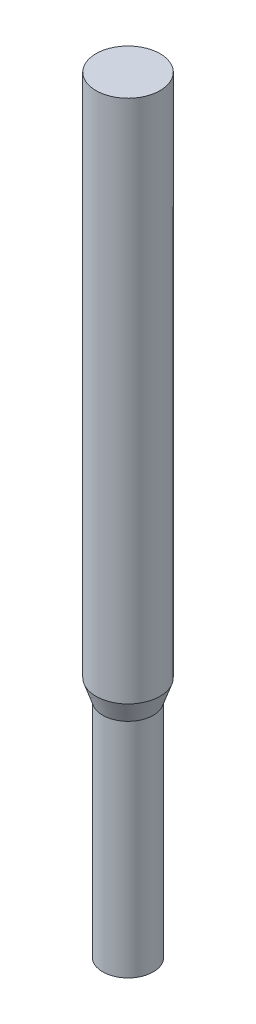
ISO-10303-21;
HEADER;
FILE_DESCRIPTION(('STEP AP214'),'2;1');
FILE_NAME('part.step','',(''),(''),'','','');
FILE_SCHEMA(('AUTOMOTIVE_DESIGN { 1 0 10303 214 1 1 1 1 }'));
ENDSEC;
DATA;
#1=APPLICATION_CONTEXT('core data for automotive mechanical design processes');
#2=APPLICATION_PROTOCOL_DEFINITION('international standard','automotive_design',2000,#1);
#3=PRODUCT_CONTEXT('',#1,'mechanical');
#4=PRODUCT('Part','Part','',(#3));
#5=PRODUCT_RELATED_PRODUCT_CATEGORY('part','',(#4));
#6=PRODUCT_DEFINITION_FORMATION('','',#4);
#7=PRODUCT_DEFINITION_CONTEXT('part definition',#1,'design');
#8=PRODUCT_DEFINITION('design','',#6,#7);
#9=PRODUCT_DEFINITION_SHAPE('','',#8);
#10=(LENGTH_UNIT() NAMED_UNIT(*) SI_UNIT(.MILLI.,.METRE.));
#11=(NAMED_UNIT(*) PLANE_ANGLE_UNIT() SI_UNIT($,.RADIAN.));
#12=(NAMED_UNIT(*) SI_UNIT($,.STERADIAN.) SOLID_ANGLE_UNIT());
#13=UNCERTAINTY_MEASURE_WITH_UNIT(LENGTH_MEASURE(1.E-05),#10,'distance_accuracy_value','');
#14=(GEOMETRIC_REPRESENTATION_CONTEXT(3) GLOBAL_UNCERTAINTY_ASSIGNED_CONTEXT((#13)) GLOBAL_UNIT_ASSIGNED_CONTEXT((#10,
#11,#12)) REPRESENTATION_CONTEXT('',''));
#15=CARTESIAN_POINT('',(0.,0.,0.));
#16=DIRECTION('',(0.,0.,1.));
#17=DIRECTION('',(1.,0.,0.));
#18=AXIS2_PLACEMENT_3D('',#15,#16,#17);
#19=CARTESIAN_POINT('',(0.,0.,0.));
#20=DIRECTION('',(0.,-1.,0.));
#21=DIRECTION('',(0.,0.,-1.));
#22=AXIS2_PLACEMENT_3D('',#19,#20,#21);
#23=PLANE('',#22);
#24=CARTESIAN_POINT('',(0.,0.,0.));
#25=DIRECTION('',(0.,-1.,0.));
#26=DIRECTION('',(0.,0.,-1.));
#27=AXIS2_PLACEMENT_3D('',#24,#25,#26);
#28=CIRCLE('',#27,1.5875);
#29=CARTESIAN_POINT('',(0.,0.,-1.5875));
#30=VERTEX_POINT('',#29);
#31=EDGE_CURVE('E10',#30,#30,#28,.T.);
#32=ORIENTED_EDGE('',*,*,#31,.F.);
#33=EDGE_LOOP('',(#32));
#34=FACE_BOUND('',#33,.T.);
#35=ADVANCED_FACE('F32',(#34),#23,.F.);
#36=CARTESIAN_POINT('',(0.,-38.,0.));
#37=DIRECTION('',(0.,-1.,0.));
#38=DIRECTION('',(0.,0.,-1.));
#39=AXIS2_PLACEMENT_3D('',#36,#37,#38);
#40=CYLINDRICAL_SURFACE('',#39,1.5875);
#41=CARTESIAN_POINT('',(0.,-26.,0.));
#42=DIRECTION('',(0.,-1.,0.));
#43=DIRECTION('',(0.,0.,-1.));
#44=AXIS2_PLACEMENT_3D('',#41,#42,#43);
#45=CIRCLE('',#44,1.5875);
#46=CARTESIAN_POINT('',(0.,-26.,-1.5875));
#47=VERTEX_POINT('',#46);
#48=EDGE_CURVE('E38',#47,#47,#45,.T.);
#49=ORIENTED_EDGE('',*,*,#48,.F.);
#50=EDGE_LOOP('',(#49));
#51=FACE_BOUND('',#50,.T.);
#52=ORIENTED_EDGE('',*,*,#31,.T.);
#53=EDGE_LOOP('',(#52));
#54=FACE_BOUND('',#53,.T.);
#55=ADVANCED_FACE('F62',(#51,#54),#40,.T.);
#56=CARTESIAN_POINT('',(0.,-26.,0.));
#57=DIRECTION('',(0.,1.,0.));
#58=DIRECTION('',(0.,0.,1.));
#59=AXIS2_PLACEMENT_3D('',#56,#57,#58);
#60=CONICAL_SURFACE('',#59,1.5875,0.330448933391721);
#61=CARTESIAN_POINT('',(0.,-26.9838888608922,0.));
#62=DIRECTION('',(0.,-1.,0.));
#63=DIRECTION('',(0.,0.,-1.));
#64=AXIS2_PLACEMENT_3D('',#61,#62,#63);
#65=CIRCLE('',#64,1.25);
#66=CARTESIAN_POINT('',(0.,-26.9838888608922,-1.25));
#67=VERTEX_POINT('',#66);
#68=EDGE_CURVE('E42',#67,#67,#65,.T.);
#69=ORIENTED_EDGE('',*,*,#68,.F.);
#70=EDGE_LOOP('',(#69));
#71=FACE_BOUND('',#70,.T.);
#72=ORIENTED_EDGE('',*,*,#48,.T.);
#73=EDGE_LOOP('',(#72));
#74=FACE_BOUND('',#73,.T.);
#75=ADVANCED_FACE('F57',(#71,#74),#60,.T.);
#76=CARTESIAN_POINT('',(0.,-38.,0.));
#77=DIRECTION('',(0.,-1.,0.));
#78=DIRECTION('',(0.,0.,-1.));
#79=AXIS2_PLACEMENT_3D('',#76,#77,#78);
#80=CYLINDRICAL_SURFACE('',#79,1.25);
#81=CARTESIAN_POINT('',(0.,-38.,0.));
#82=DIRECTION('',(0.,-1.,0.));
#83=DIRECTION('',(0.,0.,-1.));
#84=AXIS2_PLACEMENT_3D('',#81,#82,#83);
#85=CIRCLE('',#84,1.25);
#86=CARTESIAN_POINT('',(0.,-38.,-1.25));
#87=VERTEX_POINT('',#86);
#88=EDGE_CURVE('E46',#87,#87,#85,.T.);
#89=ORIENTED_EDGE('',*,*,#88,.F.);
#90=EDGE_LOOP('',(#89));
#91=FACE_BOUND('',#90,.T.);
#92=ORIENTED_EDGE('',*,*,#68,.T.);
#93=EDGE_LOOP('',(#92));
#94=FACE_BOUND('',#93,.T.);
#95=ADVANCED_FACE('F54',(#91,#94),#80,.T.);
#96=CARTESIAN_POINT('',(-1.25,-38.,0.));
#97=DIRECTION('',(0.,1.,0.));
#98=DIRECTION('',(0.,0.,1.));
#99=AXIS2_PLACEMENT_3D('',#96,#97,#98);
#100=PLANE('',#99);
#101=ORIENTED_EDGE('',*,*,#88,.T.);
#102=EDGE_LOOP('',(#101));
#103=FACE_BOUND('',#102,.T.);
#104=ADVANCED_FACE('F52',(#103),#100,.F.);
#105=CLOSED_SHELL('',(#35,#55,#75,#95,#104));
#106=MANIFOLD_SOLID_BREP('B2',#105);
#107=ADVANCED_BREP_SHAPE_REPRESENTATION('',(#18,#106),#14);
#108=SHAPE_DEFINITION_REPRESENTATION(#9,#107);
ENDSEC;
END-ISO-10303-21;
